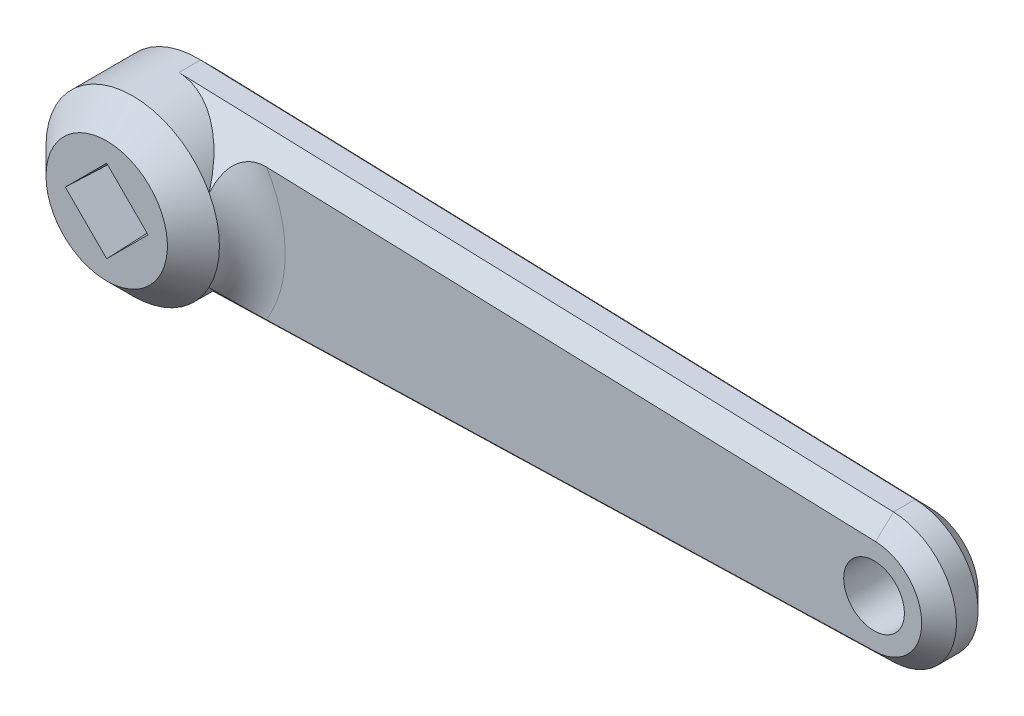
ISO-10303-21;
HEADER;
FILE_DESCRIPTION(('STEP AP214'),'2;1');
FILE_NAME('part.step','',(''),(''),'','','');
FILE_SCHEMA(('AUTOMOTIVE_DESIGN { 1 0 10303 214 1 1 1 1 }'));
ENDSEC;
DATA;
#1=APPLICATION_CONTEXT('core data for automotive mechanical design processes');
#2=APPLICATION_PROTOCOL_DEFINITION('international standard','automotive_design',2000,#1);
#3=PRODUCT_CONTEXT('',#1,'mechanical');
#4=PRODUCT('Part','Part','',(#3));
#5=PRODUCT_RELATED_PRODUCT_CATEGORY('part','',(#4));
#6=PRODUCT_DEFINITION_FORMATION('','',#4);
#7=PRODUCT_DEFINITION_CONTEXT('part definition',#1,'design');
#8=PRODUCT_DEFINITION('design','',#6,#7);
#9=PRODUCT_DEFINITION_SHAPE('','',#8);
#10=(LENGTH_UNIT() NAMED_UNIT(*) SI_UNIT(.MILLI.,.METRE.));
#11=(NAMED_UNIT(*) PLANE_ANGLE_UNIT() SI_UNIT($,.RADIAN.));
#12=(NAMED_UNIT(*) SI_UNIT($,.STERADIAN.) SOLID_ANGLE_UNIT());
#13=UNCERTAINTY_MEASURE_WITH_UNIT(LENGTH_MEASURE(1.E-05),#10,'distance_accuracy_value','');
#14=(GEOMETRIC_REPRESENTATION_CONTEXT(3) GLOBAL_UNCERTAINTY_ASSIGNED_CONTEXT((#13)) GLOBAL_UNIT_ASSIGNED_CONTEXT((#10,
#11,#12)) REPRESENTATION_CONTEXT('',''));
#15=CARTESIAN_POINT('',(0.,0.,0.));
#16=DIRECTION('',(0.,0.,1.));
#17=DIRECTION('',(1.,0.,0.));
#18=AXIS2_PLACEMENT_3D('',#15,#16,#17);
#19=CARTESIAN_POINT('',(-1.11022302462516E-12,9.54594154601793,24.999999999999));
#20=DIRECTION('',(-0.706676030840832,0.706676030840837,-0.0348994967024992));
#21=DIRECTION('',(-0.70710678118655,-0.707106781186545,0.));
#22=AXIS2_PLACEMENT_3D('',#19,#20,#21);
#23=PLANE('',#22);
#24=DIRECTION('',(0.0493253122023316,0.,-0.998782765958716));
#25=VECTOR('',#24,1.);
#26=CARTESIAN_POINT('',(-9.54594154601984,9.71445146547012E-13,24.9999999999989));
#27=LINE('',#26,#25);
#28=CARTESIAN_POINT('',(-9.54594154601942,5.42530033445851E-13,24.9999999999992));
#29=VERTEX_POINT('',#28);
#30=CARTESIAN_POINT('',(-8.75577473283918,2.00767137290004E-13,8.99999999999949));
#31=VERTEX_POINT('',#30);
#32=EDGE_CURVE('E116',#29,#31,#27,.T.);
#33=ORIENTED_EDGE('',*,*,#32,.T.);
#34=DIRECTION('',(0.707106781186624,0.707106781186471,0.));
#35=VECTOR('',#34,1.);
#36=CARTESIAN_POINT('',(-8.75577473283906,3.05311331771918E-13,8.99999999999901));
#37=LINE('',#36,#35);
#38=CARTESIAN_POINT('',(3.86821908839246E-13,8.75577473283835,8.99999999999955));
#39=VERTEX_POINT('',#38);
#40=EDGE_CURVE('E441',#31,#39,#37,.T.);
#41=ORIENTED_EDGE('',*,*,#40,.T.);
#42=DIRECTION('',(0.,0.0493253122023341,0.998782765958715));
#43=VECTOR('',#42,1.);
#44=CARTESIAN_POINT('',(1.57550838694731E-12,8.75577473283906,8.99999999999936));
#45=LINE('',#44,#43);
#46=CARTESIAN_POINT('',(-6.72071391349439E-13,9.54594154601836,24.999999999999));
#47=VERTEX_POINT('',#46);
#48=EDGE_CURVE('E106',#39,#47,#45,.T.);
#49=ORIENTED_EDGE('',*,*,#48,.T.);
#50=DIRECTION('',(0.707106781186613,0.707106781186482,0.));
#51=VECTOR('',#50,1.);
#52=CARTESIAN_POINT('',(-9.54594154601984,9.71445146547012E-13,24.9999999999992));
#53=LINE('',#52,#51);
#54=EDGE_CURVE('E442',#29,#47,#53,.T.);
#55=ORIENTED_EDGE('',*,*,#54,.F.);
#56=EDGE_LOOP('',(#33,#41,#49,#55));
#57=FACE_BOUND('',#56,.T.);
#58=ADVANCED_FACE('F16',(#57),#23,.F.);
#59=CARTESIAN_POINT('',(9.54594154601718,3.21964677141295E-12,24.9999999999994));
#60=DIRECTION('',(0.706676030840833,0.706676030840837,-0.0348994967024994));
#61=DIRECTION('',(-0.70710678118655,0.707106781186545,0.));
#62=AXIS2_PLACEMENT_3D('',#59,#60,#61);
#63=PLANE('',#62);
#64=ORIENTED_EDGE('',*,*,#48,.F.);
#65=DIRECTION('',(0.707106781186715,-0.707106781186381,0.));
#66=VECTOR('',#65,1.);
#67=CARTESIAN_POINT('',(-3.33066907387547E-13,8.75577473283715,8.99999999999901));
#68=LINE('',#67,#66);
#69=CARTESIAN_POINT('',(8.75577473283873,2.10169203004526E-12,8.99999999999976));
#70=VERTEX_POINT('',#69);
#71=EDGE_CURVE('E123',#39,#70,#68,.T.);
#72=ORIENTED_EDGE('',*,*,#71,.T.);
#73=DIRECTION('',(0.0493253122022692,0.,0.998782765958719));
#74=VECTOR('',#73,1.);
#75=CARTESIAN_POINT('',(8.75577473283896,1.98566206879858E-12,8.99999999999988));
#76=LINE('',#75,#74);
#77=CARTESIAN_POINT('',(9.54594154601751,2.88047219548951E-12,24.9999999999991));
#78=VERTEX_POINT('',#77);
#79=EDGE_CURVE('E112',#70,#78,#76,.T.);
#80=ORIENTED_EDGE('',*,*,#79,.T.);
#81=DIRECTION('',(0.70710678118668,-0.707106781186415,0.));
#82=VECTOR('',#81,1.);
#83=CARTESIAN_POINT('',(-1.11022302462516E-12,9.54594154601793,24.9999999999992));
#84=LINE('',#83,#82);
#85=EDGE_CURVE('E447',#47,#78,#84,.T.);
#86=ORIENTED_EDGE('',*,*,#85,.F.);
#87=EDGE_LOOP('',(#64,#72,#80,#86));
#88=FACE_BOUND('',#87,.T.);
#89=ADVANCED_FACE('F128',(#88),#63,.F.);
#90=CARTESIAN_POINT('',(-1.11022302462516E-13,-9.54594154601673,24.9999999999996));
#91=DIRECTION('',(0.706676030840832,-0.706676030840837,-0.0348994967024997));
#92=DIRECTION('',(0.70710678118655,0.707106781186545,0.));
#93=AXIS2_PLACEMENT_3D('',#90,#91,#92);
#94=PLANE('',#93);
#95=ORIENTED_EDGE('',*,*,#79,.F.);
#96=DIRECTION('',(-0.707106781186373,-0.707106781186722,0.));
#97=VECTOR('',#96,1.);
#98=CARTESIAN_POINT('',(8.75577473283873,2.22044604925031E-12,8.99999999999901));
#99=LINE('',#98,#97);
#100=CARTESIAN_POINT('',(-1.18421982289729E-12,-8.75577473284006,8.9999999999998));
#101=VERTEX_POINT('',#100);
#102=EDGE_CURVE('E115',#70,#101,#99,.T.);
#103=ORIENTED_EDGE('',*,*,#102,.T.);
#104=DIRECTION('',(-1.21280197952993E-13,-0.0493253122021546,0.998782765958725));
#105=VECTOR('',#104,1.);
#106=CARTESIAN_POINT('',(8.29197821516914E-13,-8.75577473284001,9.00000000000019));
#107=LINE('',#106,#105);
#108=CARTESIAN_POINT('',(-3.62139549743594E-13,-9.54594154601698,24.9999999999994));
#109=VERTEX_POINT('',#108);
#110=EDGE_CURVE('E129',#101,#109,#107,.T.);
#111=ORIENTED_EDGE('',*,*,#110,.T.);
#112=DIRECTION('',(-0.707106781186449,-0.707106781186646,0.));
#113=VECTOR('',#112,1.);
#114=CARTESIAN_POINT('',(9.54594154601718,3.21964677141295E-12,24.9999999999992));
#115=LINE('',#114,#113);
#116=EDGE_CURVE('E83',#78,#109,#115,.T.);
#117=ORIENTED_EDGE('',*,*,#116,.F.);
#118=EDGE_LOOP('',(#95,#103,#111,#117));
#119=FACE_BOUND('',#118,.T.);
#120=ADVANCED_FACE('F114',(#119),#94,.F.);
#121=CARTESIAN_POINT('',(-9.54594154601984,9.71445146547012E-13,24.9999999999989));
#122=DIRECTION('',(-0.706676030840833,-0.706676030840837,-0.0348994967024992));
#123=DIRECTION('',(0.70710678118655,-0.707106781186545,0.));
#124=AXIS2_PLACEMENT_3D('',#121,#122,#123);
#125=PLANE('',#124);
#126=ORIENTED_EDGE('',*,*,#110,.F.);
#127=DIRECTION('',(-0.707106781186419,0.707106781186676,0.));
#128=VECTOR('',#127,1.);
#129=CARTESIAN_POINT('',(-5.55111512312578E-13,-8.75577473284139,8.99999999999901));
#130=LINE('',#129,#128);
#131=EDGE_CURVE('E126',#101,#31,#130,.T.);
#132=ORIENTED_EDGE('',*,*,#131,.T.);
#133=ORIENTED_EDGE('',*,*,#32,.F.);
#134=DIRECTION('',(-0.707106781186623,0.707106781186472,0.));
#135=VECTOR('',#134,1.);
#136=CARTESIAN_POINT('',(-1.11022302462516E-13,-9.54594154601673,24.9999999999992));
#137=LINE('',#136,#135);
#138=EDGE_CURVE('E342',#109,#29,#137,.T.);
#139=ORIENTED_EDGE('',*,*,#138,.F.);
#140=EDGE_LOOP('',(#126,#132,#133,#139));
#141=FACE_BOUND('',#140,.T.);
#142=ADVANCED_FACE('F421',(#141),#125,.F.);
#143=CARTESIAN_POINT('',(7.7715611723761E-13,9.54594154601568,8.99999999999901));
#144=DIRECTION('',(0.,0.,-1.));
#145=DIRECTION('',(-1.,0.,0.));
#146=AXIS2_PLACEMENT_3D('',#143,#144,#145);
#147=PLANE('',#146);
#148=ORIENTED_EDGE('',*,*,#131,.F.);
#149=ORIENTED_EDGE('',*,*,#102,.F.);
#150=ORIENTED_EDGE('',*,*,#71,.F.);
#151=ORIENTED_EDGE('',*,*,#40,.F.);
#152=EDGE_LOOP('',(#148,#149,#150,#151));
#153=FACE_BOUND('',#152,.T.);
#154=CARTESIAN_POINT('',(-5.55111512312578E-13,-3.49720252756924E-12,8.99999999999987));
#155=DIRECTION('',(0.,0.,-1.));
#156=DIRECTION('',(-1.,0.,0.));
#157=AXIS2_PLACEMENT_3D('',#154,#155,#156);
#158=CIRCLE('',#157,6.00000000000007);
#159=CARTESIAN_POINT('',(-6.00000000000062,-3.49720252756924E-12,8.99999999999987));
#160=VERTEX_POINT('',#159);
#161=EDGE_CURVE('E340',#160,#160,#158,.T.);
#162=ORIENTED_EDGE('',*,*,#161,.T.);
#163=EDGE_LOOP('',(#162));
#164=FACE_BOUND('',#163,.T.);
#165=ADVANCED_FACE('F120',(#153,#164),#147,.F.);
#166=CARTESIAN_POINT('',(-5.55111512312578E-13,-3.49720252756924E-12,24.9999999999992));
#167=DIRECTION('',(0.,0.,1.));
#168=DIRECTION('',(1.,0.,0.));
#169=AXIS2_PLACEMENT_3D('',#166,#167,#168);
#170=PLANE('',#169);
#171=ORIENTED_EDGE('',*,*,#116,.T.);
#172=ORIENTED_EDGE('',*,*,#138,.T.);
#173=ORIENTED_EDGE('',*,*,#54,.T.);
#174=ORIENTED_EDGE('',*,*,#85,.T.);
#175=EDGE_LOOP('',(#171,#172,#173,#174));
#176=FACE_BOUND('',#175,.T.);
#177=CARTESIAN_POINT('',(-5.55111512312578E-13,-3.49720252756924E-12,24.9999999999993));
#178=DIRECTION('',(0.,0.,-1.));
#179=DIRECTION('',(-1.,0.,0.));
#180=AXIS2_PLACEMENT_3D('',#177,#178,#179);
#181=CIRCLE('',#180,14.0000000000001);
#182=CARTESIAN_POINT('',(-14.0000000000006,-3.49720252756924E-12,24.9999999999993));
#183=VERTEX_POINT('',#182);
#184=EDGE_CURVE('E337',#183,#183,#181,.T.);
#185=ORIENTED_EDGE('',*,*,#184,.F.);
#186=EDGE_LOOP('',(#185));
#187=FACE_BOUND('',#186,.T.);
#188=ADVANCED_FACE('F417',(#176,#187),#170,.T.);
#189=CARTESIAN_POINT('',(-5.55111512312578E-13,-3.49720252756924E-12,24.9999999999992));
#190=DIRECTION('',(0.,0.,-1.));
#191=DIRECTION('',(-1.,0.,0.));
#192=AXIS2_PLACEMENT_3D('',#189,#190,#191);
#193=CYLINDRICAL_SURFACE('',#192,6.00000000000007);
#194=CARTESIAN_POINT('',(-5.55111512312578E-13,-3.49720252756924E-12,7.00000000000006));
#195=DIRECTION('',(0.,0.,-1.));
#196=DIRECTION('',(-1.,0.,0.));
#197=AXIS2_PLACEMENT_3D('',#194,#195,#196);
#198=CIRCLE('',#197,6.00000000000007);
#199=CARTESIAN_POINT('',(-6.00000000000062,-3.49720252756924E-12,7.00000000000006));
#200=VERTEX_POINT('',#199);
#201=EDGE_CURVE('E162',#200,#200,#198,.F.);
#202=ORIENTED_EDGE('',*,*,#201,.F.);
#203=EDGE_LOOP('',(#202));
#204=FACE_BOUND('',#203,.T.);
#205=ORIENTED_EDGE('',*,*,#161,.F.);
#206=EDGE_LOOP('',(#205));
#207=FACE_BOUND('',#206,.T.);
#208=ADVANCED_FACE('F413',(#204,#207),#193,.F.);
#209=CARTESIAN_POINT('',(-5.55111512312578E-13,-3.49720252756924E-12,18.9999999999984));
#210=DIRECTION('',(0.,0.,-1.));
#211=DIRECTION('',(-1.,0.,0.));
#212=AXIS2_PLACEMENT_3D('',#209,#210,#211);
#213=CONICAL_SURFACE('',#212,20.0000000000009,0.785398163397447);
#214=CARTESIAN_POINT('',(-1.66533453693773E-12,-3.19189119579733E-12,18.9999999999992));
#215=DIRECTION('',(0.,0.,1.));
#216=DIRECTION('',(1.,0.,0.));
#217=AXIS2_PLACEMENT_3D('',#214,#215,#216);
#218=CIRCLE('',#217,20.0000000000001);
#219=CARTESIAN_POINT('',(17.5945735632283,-9.50952055196156,18.9999999999996));
#220=VERTEX_POINT('',#219);
#221=CARTESIAN_POINT('',(17.6365068293157,9.43152304028435,18.9999999999992));
#222=VERTEX_POINT('',#221);
#223=EDGE_CURVE('E74',#220,#222,#218,.T.);
#224=ORIENTED_EDGE('',*,*,#223,.T.);
#225=CARTESIAN_POINT('',(-5.55111512312578E-13,-3.52495810318487E-12,18.9999999999993));
#226=DIRECTION('',(0.,0.,-1.));
#227=DIRECTION('',(-1.,0.,0.));
#228=AXIS2_PLACEMENT_3D('',#225,#226,#227);
#229=CIRCLE('',#228,20.0000000000002);
#230=EDGE_CURVE('E71',#220,#222,#229,.T.);
#231=ORIENTED_EDGE('',*,*,#230,.F.);
#232=EDGE_LOOP('',(#224,#231));
#233=FACE_BOUND('',#232,.T.);
#234=ORIENTED_EDGE('',*,*,#184,.T.);
#235=EDGE_LOOP('',(#234));
#236=FACE_BOUND('',#235,.T.);
#237=ADVANCED_FACE('F416',(#233,#236),#213,.T.);
#238=CARTESIAN_POINT('',(0.520251892318857,15.9915395746817,12.9999999999998));
#239=DIRECTION('',(0.0229921025614232,0.706732879679291,0.707106781186563));
#240=DIRECTION('',(0.,-0.707293756647439,0.706919756271921));
#241=AXIS2_PLACEMENT_3D('',#238,#239,#240);
#242=PLANE('',#241);
#243=CARTESIAN_POINT('',(17.6365068293145,9.43152304028423,19.0000000000001));
#244=CARTESIAN_POINT('',(17.6324492783153,9.53117909508016,18.9005285752788));
#245=CARTESIAN_POINT('',(17.6299056692793,9.63084023198028,18.8010028441925));
#246=CARTESIAN_POINT('',(17.6281885334298,9.83014197728663,18.6018623189303));
#247=CARTESIAN_POINT('',(17.6290157066384,9.92978257713076,18.5022475105504));
#248=CARTESIAN_POINT('',(17.6370855623149,10.2291946594442,18.2027313529792));
#249=CARTESIAN_POINT('',(17.6499466304135,10.4288259824138,18.0027874031899));
#250=CARTESIAN_POINT('',(17.6943838686319,10.8306956315914,17.5996853434425));
#251=CARTESIAN_POINT('',(17.7263192638325,11.0329091198356,17.396540377844));
#252=CARTESIAN_POINT('',(17.8133847779586,11.4343072026391,16.992523545042));
#253=CARTESIAN_POINT('',(17.8684838220837,11.6334954860393,16.7916490013684));
#254=CARTESIAN_POINT('',(17.9811291504029,11.9544302251184,16.4672212184877));
#255=CARTESIAN_POINT('',(18.0303558416297,12.0777690070202,16.3423470127915));
#256=CARTESIAN_POINT('',(18.1410879119486,12.3215137805605,16.0951305902093));
#257=CARTESIAN_POINT('',(18.2025938506006,12.4419196382664,15.9727884889907));
#258=CARTESIAN_POINT('',(18.3384866330088,12.678101281287,15.7323130784671));
#259=CARTESIAN_POINT('',(18.4128001917013,12.7938990307777,15.6141601995187));
#260=CARTESIAN_POINT('',(18.5752154007747,13.0203990449581,15.3824989020004));
#261=CARTESIAN_POINT('',(18.663316415698,13.1311015441815,15.2689902696832));
#262=CARTESIAN_POINT('',(18.8547686121596,13.3475388437816,15.0464422065901));
#263=CARTESIAN_POINT('',(18.9582991199876,13.4531927834637,14.9374777628241));
#264=CARTESIAN_POINT('',(19.1794710297376,13.6567466416959,14.7268399700695));
#265=CARTESIAN_POINT('',(19.2971124766095,13.7546465355442,14.6251666443081));
#266=CARTESIAN_POINT('',(19.5456814416496,13.9416300786389,14.4301995690802));
#267=CARTESIAN_POINT('',(19.6766127970629,14.0307111668492,14.3369082545247));
#268=CARTESIAN_POINT('',(19.9504002536607,14.1992169701809,14.1595891504666));
#269=CARTESIAN_POINT('',(20.0932556714439,14.2786422380644,14.0755608307154));
#270=CARTESIAN_POINT('',(20.3702263616092,14.4178160614934,13.9274546912905));
#271=CARTESIAN_POINT('',(20.5031082611771,14.478781646804,13.8622005894223));
#272=CARTESIAN_POINT('',(20.7755826855021,14.5929503371223,13.7392325604049));
#273=CARTESIAN_POINT('',(20.9151775499641,14.6461507092257,13.6815212886378));
#274=CARTESIAN_POINT('',(21.2002809798759,14.7449481349988,13.5735057546975));
#275=CARTESIAN_POINT('',(21.3458045793323,14.7905241423418,13.5232220388803));
#276=CARTESIAN_POINT('',(21.6413578128167,14.8740829200713,13.4300973120132));
#277=CARTESIAN_POINT('',(21.7913885917128,14.9120637421236,13.387258211041));
#278=CARTESIAN_POINT('',(22.1802304176111,14.9999479921942,13.2867769511204));
#279=CARTESIAN_POINT('',(22.4215992289295,15.0445750188786,13.2343252358604));
#280=CARTESIAN_POINT('',(22.9099832529839,15.1171337909964,13.1459246615789));
#281=CARTESIAN_POINT('',(23.1570046162615,15.1450463557166,13.1099947731388));
#282=CARTESIAN_POINT('',(23.6515408939301,15.1851964379187,13.0537857067176));
#283=CARTESIAN_POINT('',(23.8990270913461,15.1975853325457,13.03335616539));
#284=CARTESIAN_POINT('',(24.3950950747173,15.208346169225,13.0064709995975));
#285=CARTESIAN_POINT('',(24.6436769115016,15.2067174539796,13.00001603043));
#286=CARTESIAN_POINT('',(24.8919033409767,15.1986579558828,12.9999999999994));
#287=B_SPLINE_CURVE_WITH_KNOTS('',3,(#243,#244,#245,#246,#247,#248,#249,#250,#251,#252,#253,
#254,#255,#256,#257,#258,#259,#260,#261,#262,#263,#264,#265,#266,#267,#268,#269,#270,#271,#272,
#273,#274,#275,#276,#277,#278,#279,#280,#281,#282,#283,#284,#285,#286),.UNSPECIFIED.,.F.,.F.,(4,
2,2,2,2,2,2,2,2,2,2,2,2,2,2,2,2,2,2,2,2,4),(0.,0.422572707385618,0.845233176390138,
1.69322462304153,2.55771330785163,3.42104593482224,3.96753104509211,4.51404106413532,
5.05752192134922,5.60097773714885,6.15132955288096,6.70168312178357,7.25219605081681,
7.80267745004968,8.28246890136818,8.76242880636775,9.24369248150447,9.72507945356262,
10.4767067010257,11.2291948350407,11.9742865782598,12.719413259662),.UNSPECIFIED.);
#288=CARTESIAN_POINT('',(24.8919033409765,15.198657955877,13.0000000000001));
#289=VERTEX_POINT('',#288);
#290=EDGE_CURVE('E176',#222,#289,#287,.T.);
#291=ORIENTED_EDGE('',*,*,#290,.T.);
#292=DIRECTION('',(-0.999471223417468,0.0325157432698232,0.));
#293=VECTOR('',#292,1.);
#294=CARTESIAN_POINT('',(165.35767317597,10.628892660848,12.9999999999995));
#295=LINE('',#294,#293);
#296=CARTESIAN_POINT('',(165.35767317597,10.6288926608479,12.9999999999998));
#297=VERTEX_POINT('',#296);
#298=EDGE_CURVE('E255',#297,#289,#295,.T.);
#299=ORIENTED_EDGE('',*,*,#298,.F.);
#300=DIRECTION('',(-0.0229921025612538,-0.706732879679311,0.707106781186549));
#301=VECTOR('',#300,1.);
#302=CARTESIAN_POINT('',(165.357673175969,10.6288926608476,13.0000000000001));
#303=LINE('',#302,#301);
#304=CARTESIAN_POINT('',(165.487736149049,14.626777554518,9.00000000000023));
#305=VERTEX_POINT('',#304);
#306=EDGE_CURVE('E165',#305,#297,#303,.T.);
#307=ORIENTED_EDGE('',*,*,#306,.F.);
#308=DIRECTION('',(0.999471223417468,-0.0325157432698273,0.));
#309=VECTOR('',#308,1.);
#310=CARTESIAN_POINT('',(0.650314865397128,19.9894244683475,8.99999999999973));
#311=LINE('',#310,#309);
#312=CARTESIAN_POINT('',(0.650314865396452,19.9894244683468,9.0000000000026));
#313=VERTEX_POINT('',#312);
#314=EDGE_CURVE('E273',#305,#313,#311,.F.);
#315=ORIENTED_EDGE('',*,*,#314,.T.);
#316=CARTESIAN_POINT('',(-5.55111512312578E-13,-3.52495810318487E-12,29.0000000000048));
#317=DIRECTION('',(0.0229921025614232,0.706732879679291,0.707106781186563));
#318=DIRECTION('',(0.0229921025614242,0.706732879679322,-0.707106781186532));
#319=AXIS2_PLACEMENT_3D('',#316,#317,#318);
#320=ELLIPSE('',#319,28.2842712474616,20.0000000000002);
#321=EDGE_CURVE('E156',#222,#313,#320,.T.);
#322=ORIENTED_EDGE('',*,*,#321,.F.);
#323=EDGE_LOOP('',(#291,#299,#307,#315,#322));
#324=FACE_BOUND('',#323,.T.);
#325=ADVANCED_FACE('F329',(#324),#242,.T.);
#326=CARTESIAN_POINT('',(-1.66533453693773E-12,-3.19189119579733E-12,22.9999999999994));
#327=DIRECTION('',(0.,0.,1.));
#328=DIRECTION('',(1.,0.,0.));
#329=AXIS2_PLACEMENT_3D('',#326,#327,#328);
#330=TOROIDAL_SURFACE('',#329,29.1651513899117,10.);
#331=ORIENTED_EDGE('',*,*,#223,.F.);
#332=CARTESIAN_POINT('',(24.8243635479129,-15.3087239846264,12.9999999999994));
#333=CARTESIAN_POINT('',(24.61940779402,-15.3144751289374,13.0000083363896));
#334=CARTESIAN_POINT('',(24.4142661577957,-15.3158368348773,13.0044096005062));
#335=CARTESIAN_POINT('',(24.0043553764543,-15.3091428880275,13.0226153080731));
#336=CARTESIAN_POINT('',(23.7995868223742,-15.301077655926,13.036429310453));
#337=CARTESIAN_POINT('',(23.3888426034192,-15.2747008043941,13.0743335670586));
#338=CARTESIAN_POINT('',(23.1828877637396,-15.2562527888287,13.0985595786169));
#339=CARTESIAN_POINT('',(22.7738911537192,-15.2083045637055,13.1579776063259));
#340=CARTESIAN_POINT('',(22.5708486653336,-15.1788071287797,13.1931668691094));
#341=CARTESIAN_POINT('',(22.1678293661658,-15.1078069693373,13.2754598320042));
#342=CARTESIAN_POINT('',(21.9678821519048,-15.066225250129,13.3226416642687));
#343=CARTESIAN_POINT('',(21.5744268339442,-14.9704757266588,13.4294055726048));
#344=CARTESIAN_POINT('',(21.380917031594,-14.9163112732268,13.4889843468837));
#345=CARTESIAN_POINT('',(21.0035028690187,-14.7951942623352,13.6206551361877));
#346=CARTESIAN_POINT('',(20.8195544888532,-14.7283084473324,13.6926816716136));
#347=CARTESIAN_POINT('',(20.4627174378181,-14.5813754720743,13.8495802267598));
#348=CARTESIAN_POINT('',(20.2898261971301,-14.5013313855208,13.9344492461775));
#349=CARTESIAN_POINT('',(19.9764553729948,-14.3381336959012,14.1063851303931));
#350=CARTESIAN_POINT('',(19.8345225968731,-14.2563588563141,14.1921145959873));
#351=CARTESIAN_POINT('',(19.5629674553834,-14.0831852585852,14.3728478484202));
#352=CARTESIAN_POINT('',(19.4333439699496,-13.9917873776769,14.4678507898343));
#353=CARTESIAN_POINT('',(19.18773600952,-13.800260999647,14.6662007236733));
#354=CARTESIAN_POINT('',(19.0717477165675,-13.7001349602166,14.7695453666232));
#355=CARTESIAN_POINT('',(18.8541591062038,-13.4922698993593,14.9834404718929));
#356=CARTESIAN_POINT('',(18.752558349999,-13.3845311102578,15.0939907143049));
#357=CARTESIAN_POINT('',(18.5766660704664,-13.1776979068519,15.3056831185177));
#358=CARTESIAN_POINT('',(18.5005394503817,-13.0793950190525,15.406085614057));
#359=CARTESIAN_POINT('',(18.3589837597616,-12.878893851687,15.6104839653872));
#360=CARTESIAN_POINT('',(18.2935559182694,-12.7766951262395,15.7144802323597));
#361=CARTESIAN_POINT('',(18.1727128657357,-12.5687963934379,15.9256914116044));
#362=CARTESIAN_POINT('',(18.1173386942892,-12.4630840308547,16.032917521427));
#363=CARTESIAN_POINT('',(18.0162800958074,-12.2492735336539,16.2494823865582));
#364=CARTESIAN_POINT('',(17.970595297335,-12.1411754906655,16.3588210607073));
#365=CARTESIAN_POINT('',(17.8515850794543,-11.826498614027,16.6767167645063));
#366=CARTESIAN_POINT('',(17.7896733413454,-11.6175937255133,16.8872783206135));
#367=CARTESIAN_POINT('',(17.6921854967082,-11.196150373866,17.3112938052049));
#368=CARTESIAN_POINT('',(17.6566566977946,-10.9836060794131,17.5247522338355));
#369=CARTESIAN_POINT('',(17.6196870969647,-10.6654521581069,17.8438190876542));
#370=CARTESIAN_POINT('',(17.610098541733,-10.5603830283474,17.9491160995859));
#371=CARTESIAN_POINT('',(17.5956068587696,-10.3500071665313,18.1598160182347));
#372=CARTESIAN_POINT('',(17.5907040504062,-10.2447004187694,18.2652189316796));
#373=CARTESIAN_POINT('',(17.5851173243202,-10.0344141536309,18.4755791485865));
#374=CARTESIAN_POINT('',(17.5844160099373,-9.92943508832557,18.580536488828));
#375=CARTESIAN_POINT('',(17.5867762424695,-9.71947043005509,18.7903519955448));
#376=CARTESIAN_POINT('',(17.5898368442173,-9.61448484535368,18.8952101803094));
#377=CARTESIAN_POINT('',(17.5945735632279,-9.50952055196194,18.999999999998));
#378=B_SPLINE_CURVE_WITH_KNOTS('',3,(#332,#333,#334,#335,#336,#337,#338,#339,#340,#341,#342,
#343,#344,#345,#346,#347,#348,#349,#350,#351,#352,#353,#354,#355,#356,#357,#358,#359,#360,#361,
#362,#363,#364,#365,#366,#367,#368,#369,#370,#371,#372,#373,#374,#375,#376,#377),.UNSPECIFIED.,
.F.,.F.,(4,2,2,2,2,2,2,2,2,2,2,2,2,2,2,2,2,2,2,2,2,2,4),(0.,0.615108484603668,1.23084256388225,
1.85486079873995,2.47872244062249,3.10675768972841,3.73462588199718,4.35928656677739,
4.98380154097317,5.53759018554724,6.09132839055271,6.64491117349228,7.19847706953357,
7.67744772929931,8.15647337316508,8.63741249287798,9.11833317270174,10.0257181667913,
10.9347263024822,11.3818476145662,11.8289993991119,12.2742984250805,12.7194855941989),.UNSPECIFIED.);
#379=CARTESIAN_POINT('',(24.824363547913,-15.3087239846309,12.9999999999989));
#380=VERTEX_POINT('',#379);
#381=EDGE_CURVE('E166',#380,#220,#378,.T.);
#382=ORIENTED_EDGE('',*,*,#381,.F.);
#383=CARTESIAN_POINT('',(-1.66533453693773E-12,-3.19189119579733E-12,12.9999999999994));
#384=DIRECTION('',(0.,0.,1.));
#385=DIRECTION('',(0.851165255960237,-0.524897806288181,0.));
#386=AXIS2_PLACEMENT_3D('',#383,#384,#385);
#387=CIRCLE('',#386,29.1651513899121);
#388=CARTESIAN_POINT('',(29.1651513899104,-3.06480039213252E-12,12.9999999999994));
#389=VERTEX_POINT('',#388);
#390=EDGE_CURVE('E238',#389,#380,#387,.F.);
#391=ORIENTED_EDGE('',*,*,#390,.F.);
#392=CARTESIAN_POINT('',(-1.66533453693773E-12,-3.19189119579733E-12,12.9999999999994));
#393=DIRECTION('',(0.,0.,1.));
#394=DIRECTION('',(1.,0.,0.));
#395=AXIS2_PLACEMENT_3D('',#392,#393,#394);
#396=CIRCLE('',#395,29.1651513899109);
#397=EDGE_CURVE('E245',#289,#389,#396,.F.);
#398=ORIENTED_EDGE('',*,*,#397,.F.);
#399=ORIENTED_EDGE('',*,*,#290,.F.);
#400=EDGE_LOOP('',(#331,#382,#391,#398,#399));
#401=FACE_BOUND('',#400,.T.);
#402=ADVANCED_FACE('F178',(#401),#330,.F.);
#403=CARTESIAN_POINT('',(0.449440324645889,-15.9936863603931,12.9999999999995));
#404=DIRECTION('',(0.0198626438309867,-0.706827755100228,0.707106781186559));
#405=DIRECTION('',(0.,-0.707246307990044,-0.706967226846091));
#406=AXIS2_PLACEMENT_3D('',#403,#404,#405);
#407=PLANE('',#406);
#408=DIRECTION('',(0.999605397524484,0.0280900202904469,0.));
#409=VECTOR('',#408,1.);
#410=CARTESIAN_POINT('',(24.8243635479133,-15.3087239846316,12.9999999999995));
#411=LINE('',#410,#409);
#412=CARTESIAN_POINT('',(165.308990223198,-11.3609501695106,12.9999999999998));
#413=VERTEX_POINT('',#412);
#414=EDGE_CURVE('E155',#380,#413,#411,.T.);
#415=ORIENTED_EDGE('',*,*,#414,.F.);
#416=ORIENTED_EDGE('',*,*,#381,.T.);
#417=CARTESIAN_POINT('',(-5.55111512312578E-13,-3.52495810318487E-12,28.9999999999968));
#418=DIRECTION('',(0.0198626438309867,-0.706827755100228,0.707106781186559));
#419=DIRECTION('',(0.0198626438309873,-0.70682775510025,-0.707106781186536));
#420=AXIS2_PLACEMENT_3D('',#417,#418,#419);
#421=ELLIPSE('',#420,28.2842712474618,20.0000000000002);
#422=CARTESIAN_POINT('',(0.561800405806601,-19.9921079504924,8.9999999999986));
#423=VERTEX_POINT('',#422);
#424=EDGE_CURVE('E159',#423,#220,#421,.T.);
#425=ORIENTED_EDGE('',*,*,#424,.F.);
#426=DIRECTION('',(-0.999605397524486,-0.0280900202903762,0.));
#427=VECTOR('',#426,1.);
#428=CARTESIAN_POINT('',(165.421350304357,-15.3593717596093,9.00000000000001));
#429=LINE('',#428,#427);
#430=CARTESIAN_POINT('',(165.421350304358,-15.3593717596111,9.0000000000003));
#431=VERTEX_POINT('',#430);
#432=EDGE_CURVE('E300',#423,#431,#429,.F.);
#433=ORIENTED_EDGE('',*,*,#432,.T.);
#434=DIRECTION('',(-0.0198626438309455,0.706827755100239,0.707106781186549));
#435=VECTOR('',#434,1.);
#436=CARTESIAN_POINT('',(165.308990223197,-11.3609501695142,13.0000000000001));
#437=LINE('',#436,#435);
#438=EDGE_CURVE('E169',#413,#431,#437,.F.);
#439=ORIENTED_EDGE('',*,*,#438,.F.);
#440=EDGE_LOOP('',(#415,#416,#425,#433,#439));
#441=FACE_BOUND('',#440,.T.);
#442=ADVANCED_FACE('F182',(#441),#407,.T.);
#443=CARTESIAN_POINT('',(165.000000000003,-0.365290796744772,9.00000000000174));
#444=DIRECTION('',(0.,0.,-1.));
#445=DIRECTION('',(-1.,0.,0.));
#446=AXIS2_PLACEMENT_3D('',#443,#444,#445);
#447=CONICAL_SURFACE('',#446,14.9999999999985,0.785398163397446);
#448=ORIENTED_EDGE('',*,*,#306,.T.);
#449=CARTESIAN_POINT('',(165.000000000003,-0.365290796744772,12.9999999999998));
#450=DIRECTION('',(0.,0.,-1.));
#451=DIRECTION('',(-1.,0.,0.));
#452=AXIS2_PLACEMENT_3D('',#449,#450,#451);
#453=CIRCLE('',#452,11.0000000000004);
#454=EDGE_CURVE('E152',#413,#297,#453,.F.);
#455=ORIENTED_EDGE('',*,*,#454,.F.);
#456=ORIENTED_EDGE('',*,*,#438,.T.);
#457=CARTESIAN_POINT('',(165.000000000003,-0.365290796744772,8.99999999999973));
#458=DIRECTION('',(0.,0.,-1.));
#459=DIRECTION('',(-1.,0.,0.));
#460=AXIS2_PLACEMENT_3D('',#457,#458,#459);
#461=CIRCLE('',#460,15.0000000000002);
#462=EDGE_CURVE('E295',#305,#431,#461,.T.);
#463=ORIENTED_EDGE('',*,*,#462,.F.);
#464=EDGE_LOOP('',(#448,#455,#456,#463));
#465=FACE_BOUND('',#464,.T.);
#466=ADVANCED_FACE('F186',(#465),#447,.T.);
#467=CARTESIAN_POINT('',(-7.7715611723761E-13,-3.60822483003176E-12,7.00000000000006));
#468=DIRECTION('',(0.,0.,-1.));
#469=DIRECTION('',(-1.,0.,0.));
#470=AXIS2_PLACEMENT_3D('',#467,#468,#469);
#471=PLANE('',#470);
#472=CARTESIAN_POINT('',(-7.7715611723761E-13,-3.60822483003176E-12,7.00000000000006));
#473=DIRECTION('',(0.,0.,-1.));
#474=DIRECTION('',(-1.,0.,0.));
#475=AXIS2_PLACEMENT_3D('',#472,#473,#474);
#476=CIRCLE('',#475,12.5000000000001);
#477=CARTESIAN_POINT('',(-12.5000000000009,-3.60822483003176E-12,7.00000000000006));
#478=VERTEX_POINT('',#477);
#479=EDGE_CURVE('E148',#478,#478,#476,.T.);
#480=ORIENTED_EDGE('',*,*,#479,.T.);
#481=EDGE_LOOP('',(#480));
#482=FACE_BOUND('',#481,.T.);
#483=ORIENTED_EDGE('',*,*,#201,.T.);
#484=EDGE_LOOP('',(#483));
#485=FACE_BOUND('',#484,.T.);
#486=ADVANCED_FACE('F190',(#482,#485),#471,.T.);
#487=CARTESIAN_POINT('',(-5.55111512312578E-13,-3.52495810318487E-12,12.9999999999995));
#488=DIRECTION('',(0.,0.,-1.));
#489=DIRECTION('',(-1.,0.,0.));
#490=AXIS2_PLACEMENT_3D('',#487,#488,#489);
#491=CYLINDRICAL_SURFACE('',#490,20.0000000000002);
#492=DIRECTION('',(0.,0.,1.));
#493=VECTOR('',#492,1.);
#494=CARTESIAN_POINT('',(0.650314865396792,19.9894244683475,12.9999999999997));
#495=LINE('',#494,#493);
#496=CARTESIAN_POINT('',(0.650314865396569,19.9894244683464,3.99999999999992));
#497=VERTEX_POINT('',#496);
#498=EDGE_CURVE('E257',#313,#497,#495,.F.);
#499=ORIENTED_EDGE('',*,*,#498,.T.);
#500=CARTESIAN_POINT('',(0.,-1.52655665885959E-12,3.99999999999992));
#501=DIRECTION('',(0.,0.,1.));
#502=DIRECTION('',(1.,0.,0.));
#503=AXIS2_PLACEMENT_3D('',#500,#501,#502);
#504=CIRCLE('',#503,20.0000000000001);
#505=CARTESIAN_POINT('',(0.561800405806372,-19.9921079504921,4.00000000000202));
#506=VERTEX_POINT('',#505);
#507=EDGE_CURVE('E151',#506,#497,#504,.F.);
#508=ORIENTED_EDGE('',*,*,#507,.F.);
#509=DIRECTION('',(0.,0.,1.));
#510=VECTOR('',#509,1.);
#511=CARTESIAN_POINT('',(0.561800405806279,-19.9921079504912,13.0000000000001));
#512=LINE('',#511,#510);
#513=EDGE_CURVE('E158',#506,#423,#512,.T.);
#514=ORIENTED_EDGE('',*,*,#513,.T.);
#515=ORIENTED_EDGE('',*,*,#424,.T.);
#516=ORIENTED_EDGE('',*,*,#230,.T.);
#517=ORIENTED_EDGE('',*,*,#321,.T.);
#518=EDGE_LOOP('',(#499,#508,#514,#515,#516,#517));
#519=FACE_BOUND('',#518,.T.);
#520=ADVANCED_FACE('F194',(#519),#491,.T.);
#521=CARTESIAN_POINT('',(165.421350304357,-15.3593717596093,13.0000000000001));
#522=DIRECTION('',(-0.0280900202903762,0.999605397524486,0.));
#523=DIRECTION('',(-0.999605397524486,-0.0280900202903762,0.));
#524=AXIS2_PLACEMENT_3D('',#521,#522,#523);
#525=PLANE('',#524);
#526=ORIENTED_EDGE('',*,*,#432,.F.);
#527=ORIENTED_EDGE('',*,*,#513,.F.);
#528=DIRECTION('',(0.999605397524486,0.0280900202903914,0.));
#529=VECTOR('',#528,1.);
#530=CARTESIAN_POINT('',(0.56180040580639,-19.9921079504919,4.00000000000335));
#531=LINE('',#530,#529);
#532=CARTESIAN_POINT('',(165.421350304359,-15.3593717596091,3.99999999999978));
#533=VERTEX_POINT('',#532);
#534=EDGE_CURVE('E262',#506,#533,#531,.T.);
#535=ORIENTED_EDGE('',*,*,#534,.T.);
#536=DIRECTION('',(0.,0.,-1.));
#537=VECTOR('',#536,1.);
#538=CARTESIAN_POINT('',(165.421350304358,-15.3593717596123,13.0000000000001));
#539=LINE('',#538,#537);
#540=EDGE_CURVE('E279',#431,#533,#539,.T.);
#541=ORIENTED_EDGE('',*,*,#540,.F.);
#542=EDGE_LOOP('',(#526,#527,#535,#541));
#543=FACE_BOUND('',#542,.T.);
#544=ADVANCED_FACE('F198',(#543),#525,.F.);
#545=CARTESIAN_POINT('',(165.000000000003,-0.365290796744772,13.0000000000001));
#546=DIRECTION('',(0.,0.,-1.));
#547=DIRECTION('',(-1.,0.,0.));
#548=AXIS2_PLACEMENT_3D('',#545,#546,#547);
#549=CYLINDRICAL_SURFACE('',#548,15.0000000000002);
#550=ORIENTED_EDGE('',*,*,#540,.T.);
#551=CARTESIAN_POINT('',(165.000000000004,-0.365290796740858,4.00000000000065));
#552=DIRECTION('',(0.,0.,1.));
#553=DIRECTION('',(1.,0.,0.));
#554=AXIS2_PLACEMENT_3D('',#551,#552,#553);
#555=CIRCLE('',#554,15.0000000000008);
#556=CARTESIAN_POINT('',(165.48773614905,14.6267775545199,4.00000000000288));
#557=VERTEX_POINT('',#556);
#558=EDGE_CURVE('E282',#557,#533,#555,.F.);
#559=ORIENTED_EDGE('',*,*,#558,.F.);
#560=DIRECTION('',(0.,0.,1.));
#561=VECTOR('',#560,1.);
#562=CARTESIAN_POINT('',(165.48773614905,14.6267775545194,12.9999999999997));
#563=LINE('',#562,#561);
#564=EDGE_CURVE('E276',#557,#305,#563,.T.);
#565=ORIENTED_EDGE('',*,*,#564,.T.);
#566=ORIENTED_EDGE('',*,*,#462,.T.);
#567=EDGE_LOOP('',(#550,#559,#565,#566));
#568=FACE_BOUND('',#567,.T.);
#569=ADVANCED_FACE('F202',(#568),#549,.T.);
#570=CARTESIAN_POINT('',(0.650314865397128,19.9894244683475,12.9999999999997));
#571=DIRECTION('',(-0.0325157432698273,-0.999471223417468,0.));
#572=DIRECTION('',(0.999471223417468,-0.0325157432698273,0.));
#573=AXIS2_PLACEMENT_3D('',#570,#571,#572);
#574=PLANE('',#573);
#575=ORIENTED_EDGE('',*,*,#314,.F.);
#576=ORIENTED_EDGE('',*,*,#564,.F.);
#577=DIRECTION('',(-0.999471223417469,0.0325157432698147,0.));
#578=VECTOR('',#577,1.);
#579=CARTESIAN_POINT('',(165.48773614905,14.626777554519,4.00000000000363));
#580=LINE('',#579,#578);
#581=EDGE_CURVE('E265',#557,#497,#580,.T.);
#582=ORIENTED_EDGE('',*,*,#581,.T.);
#583=ORIENTED_EDGE('',*,*,#498,.F.);
#584=EDGE_LOOP('',(#575,#576,#582,#583));
#585=FACE_BOUND('',#584,.T.);
#586=ADVANCED_FACE('F206',(#585),#574,.F.);
#587=CARTESIAN_POINT('',(-5.55111512312578E-13,-3.52495810318487E-12,12.9999999999995));
#588=DIRECTION('',(0.,0.,1.));
#589=DIRECTION('',(1.,0.,0.));
#590=AXIS2_PLACEMENT_3D('',#587,#588,#589);
#591=PLANE('',#590);
#592=CARTESIAN_POINT('',(165.000000000003,-0.365290796744772,13.0000000000001));
#593=DIRECTION('',(0.,0.,-1.));
#594=DIRECTION('',(-1.,0.,0.));
#595=AXIS2_PLACEMENT_3D('',#592,#593,#594);
#596=CIRCLE('',#595,7.00000000000009);
#597=CARTESIAN_POINT('',(158.000000000003,-0.365290796744772,13.0000000000001));
#598=VERTEX_POINT('',#597);
#599=EDGE_CURVE('E144',#598,#598,#596,.T.);
#600=ORIENTED_EDGE('',*,*,#599,.T.);
#601=EDGE_LOOP('',(#600));
#602=FACE_BOUND('',#601,.T.);
#603=ORIENTED_EDGE('',*,*,#414,.T.);
#604=ORIENTED_EDGE('',*,*,#454,.T.);
#605=ORIENTED_EDGE('',*,*,#298,.T.);
#606=ORIENTED_EDGE('',*,*,#397,.T.);
#607=ORIENTED_EDGE('',*,*,#390,.T.);
#608=EDGE_LOOP('',(#603,#604,#605,#606,#607));
#609=FACE_BOUND('',#608,.T.);
#610=ADVANCED_FACE('F210',(#602,#609),#591,.T.);
#611=CARTESIAN_POINT('',(-7.7715611723761E-13,-3.60822483003176E-12,7.00000000000006));
#612=DIRECTION('',(0.,0.,-1.));
#613=DIRECTION('',(-1.,0.,0.));
#614=AXIS2_PLACEMENT_3D('',#611,#612,#613);
#615=CYLINDRICAL_SURFACE('',#614,12.5000000000001);
#616=ORIENTED_EDGE('',*,*,#479,.F.);
#617=EDGE_LOOP('',(#616));
#618=FACE_BOUND('',#617,.T.);
#619=CARTESIAN_POINT('',(-7.7715611723761E-13,-3.60822483003176E-12,0.));
#620=DIRECTION('',(0.,0.,-1.));
#621=DIRECTION('',(-1.,0.,0.));
#622=AXIS2_PLACEMENT_3D('',#619,#620,#621);
#623=CIRCLE('',#622,12.5000000000001);
#624=CARTESIAN_POINT('',(-12.5000000000009,-3.60822483003176E-12,0.));
#625=VERTEX_POINT('',#624);
#626=EDGE_CURVE('E141',#625,#625,#623,.T.);
#627=ORIENTED_EDGE('',*,*,#626,.T.);
#628=EDGE_LOOP('',(#627));
#629=FACE_BOUND('',#628,.T.);
#630=ADVANCED_FACE('F215',(#618,#629),#615,.F.);
#631=CARTESIAN_POINT('',(0.,-1.52655665885959E-12,4.00000000000187));
#632=DIRECTION('',(0.,0.,1.));
#633=DIRECTION('',(0.,-1.,0.));
#634=AXIS2_PLACEMENT_3D('',#631,#632,#633);
#635=CONICAL_SURFACE('',#634,20.0000000000021,0.78539816339745);
#636=DIRECTION('',(0.0198626438308881,-0.706827755100258,0.707106781186532));
#637=VECTOR('',#636,1.);
#638=CARTESIAN_POINT('',(0.449440324645417,-15.9936863603917,1.31058358610048E-12));
#639=LINE('',#638,#637);
#640=CARTESIAN_POINT('',(0.449440324645897,-15.9936863603918,3.77649163814915E-13));
#641=VERTEX_POINT('',#640);
#642=EDGE_CURVE('E290',#641,#506,#639,.T.);
#643=ORIENTED_EDGE('',*,*,#642,.T.);
#644=ORIENTED_EDGE('',*,*,#507,.T.);
#645=DIRECTION('',(-0.0229921025612749,-0.706732879679324,-0.707106781186535));
#646=VECTOR('',#645,1.);
#647=CARTESIAN_POINT('',(0.650314865396462,19.989424468345,3.99999999999992));
#648=LINE('',#647,#646);
#649=CARTESIAN_POINT('',(0.520251892317547,15.9915395746772,3.77128975405473E-13));
#650=VERTEX_POINT('',#649);
#651=EDGE_CURVE('E147',#497,#650,#648,.T.);
#652=ORIENTED_EDGE('',*,*,#651,.T.);
#653=CARTESIAN_POINT('',(0.,-1.52664339503339E-12,3.77302356024956E-13));
#654=DIRECTION('',(0.,0.,1.));
#655=DIRECTION('',(0.,-1.,0.));
#656=AXIS2_PLACEMENT_3D('',#653,#654,#655);
#657=CIRCLE('',#656,16.0000000000006);
#658=EDGE_CURVE('E138',#650,#641,#657,.T.);
#659=ORIENTED_EDGE('',*,*,#658,.T.);
#660=EDGE_LOOP('',(#643,#644,#652,#659));
#661=FACE_BOUND('',#660,.T.);
#662=ADVANCED_FACE('F360',(#661),#635,.T.);
#663=CARTESIAN_POINT('',(165.421350304359,-15.3593717596074,3.9999999999995));
#664=DIRECTION('',(-0.0198626438309865,0.706827755100223,0.707106781186563));
#665=DIRECTION('',(0.,-0.707246307990049,0.706967226846086));
#666=AXIS2_PLACEMENT_3D('',#663,#664,#665);
#667=PLANE('',#666);
#668=DIRECTION('',(0.999605397524486,0.028090020290401,0.));
#669=VECTOR('',#668,1.);
#670=CARTESIAN_POINT('',(0.449440324645445,-15.9936863603929,0.));
#671=LINE('',#670,#669);
#672=CARTESIAN_POINT('',(165.308990223198,-11.3609501695077,-1.79890824458795E-12));
#673=VERTEX_POINT('',#672);
#674=EDGE_CURVE('E137',#641,#673,#671,.T.);
#675=ORIENTED_EDGE('',*,*,#674,.T.);
#676=DIRECTION('',(-0.0198626438309566,0.706827755100241,-0.707106781186546));
#677=VECTOR('',#676,1.);
#678=CARTESIAN_POINT('',(165.421350304359,-15.3593717596084,4.00000000000006));
#679=LINE('',#678,#677);
#680=EDGE_CURVE('E285',#533,#673,#679,.T.);
#681=ORIENTED_EDGE('',*,*,#680,.F.);
#682=ORIENTED_EDGE('',*,*,#534,.F.);
#683=ORIENTED_EDGE('',*,*,#642,.F.);
#684=EDGE_LOOP('',(#675,#681,#682,#683));
#685=FACE_BOUND('',#684,.T.);
#686=ADVANCED_FACE('F392',(#685),#667,.F.);
#687=CARTESIAN_POINT('',(165.000000000004,-0.365290796740858,4.00000000000065));
#688=DIRECTION('',(0.,0.,1.));
#689=DIRECTION('',(1.,0.,0.));
#690=AXIS2_PLACEMENT_3D('',#687,#688,#689);
#691=CONICAL_SURFACE('',#690,15.0000000000008,0.78539816339745);
#692=DIRECTION('',(0.0229921025614768,0.706732879679317,0.707106781186535));
#693=VECTOR('',#692,1.);
#694=CARTESIAN_POINT('',(165.35767317597,10.6288926608489,3.56962723269127E-12));
#695=LINE('',#694,#693);
#696=CARTESIAN_POINT('',(165.357673175971,10.6288926608486,-6.23633089613662E-13));
#697=VERTEX_POINT('',#696);
#698=EDGE_CURVE('E268',#697,#557,#695,.T.);
#699=ORIENTED_EDGE('',*,*,#698,.T.);
#700=ORIENTED_EDGE('',*,*,#558,.T.);
#701=ORIENTED_EDGE('',*,*,#680,.T.);
#702=CARTESIAN_POINT('',(165.000000000004,-0.365290796740858,-1.79890824458795E-12));
#703=DIRECTION('',(0.,0.,1.));
#704=DIRECTION('',(1.,0.,0.));
#705=AXIS2_PLACEMENT_3D('',#702,#703,#704);
#706=CIRCLE('',#705,10.9999999999983);
#707=EDGE_CURVE('E36',#673,#697,#706,.T.);
#708=ORIENTED_EDGE('',*,*,#707,.T.);
#709=EDGE_LOOP('',(#699,#700,#701,#708));
#710=FACE_BOUND('',#709,.T.);
#711=ADVANCED_FACE('F375',(#710),#691,.T.);
#712=CARTESIAN_POINT('',(0.650314865396462,19.989424468345,3.99999999999992));
#713=DIRECTION('',(-0.0229921025614223,-0.706732879679294,0.70710678118656));
#714=DIRECTION('',(0.,-0.707293756647436,-0.706919756271925));
#715=AXIS2_PLACEMENT_3D('',#712,#713,#714);
#716=PLANE('',#715);
#717=ORIENTED_EDGE('',*,*,#581,.F.);
#718=ORIENTED_EDGE('',*,*,#698,.F.);
#719=DIRECTION('',(-0.999471223417469,0.0325157432698185,0.));
#720=VECTOR('',#719,1.);
#721=CARTESIAN_POINT('',(165.35767317597,10.6288926608525,0.));
#722=LINE('',#721,#720);
#723=EDGE_CURVE('E27',#697,#650,#722,.T.);
#724=ORIENTED_EDGE('',*,*,#723,.T.);
#725=ORIENTED_EDGE('',*,*,#651,.F.);
#726=EDGE_LOOP('',(#717,#718,#724,#725));
#727=FACE_BOUND('',#726,.T.);
#728=ADVANCED_FACE('F369',(#727),#716,.F.);
#729=CARTESIAN_POINT('',(165.000000000003,-0.365290796744772,13.0000000000001));
#730=DIRECTION('',(0.,0.,-1.));
#731=DIRECTION('',(-1.,0.,0.));
#732=AXIS2_PLACEMENT_3D('',#729,#730,#731);
#733=CYLINDRICAL_SURFACE('',#732,7.00000000000009);
#734=CARTESIAN_POINT('',(165.000000000003,-0.365290796744772,3.33066907387547E-13));
#735=DIRECTION('',(0.,0.,-1.));
#736=DIRECTION('',(-1.,0.,0.));
#737=AXIS2_PLACEMENT_3D('',#734,#735,#736);
#738=CIRCLE('',#737,7.00000000000009);
#739=CARTESIAN_POINT('',(158.000000000003,-0.365290796744772,3.33066907387547E-13));
#740=VERTEX_POINT('',#739);
#741=EDGE_CURVE('E11',#740,#740,#738,.T.);
#742=ORIENTED_EDGE('',*,*,#741,.T.);
#743=EDGE_LOOP('',(#742));
#744=FACE_BOUND('',#743,.T.);
#745=ORIENTED_EDGE('',*,*,#599,.F.);
#746=EDGE_LOOP('',(#745));
#747=FACE_BOUND('',#746,.T.);
#748=ADVANCED_FACE('F398',(#744,#747),#733,.F.);
#749=CARTESIAN_POINT('',(-3.33066907387547E-13,-2.66453525910038E-12,0.));
#750=DIRECTION('',(0.,0.,1.));
#751=DIRECTION('',(1.,0.,0.));
#752=AXIS2_PLACEMENT_3D('',#749,#750,#751);
#753=PLANE('',#752);
#754=ORIENTED_EDGE('',*,*,#741,.F.);
#755=EDGE_LOOP('',(#754));
#756=FACE_BOUND('',#755,.T.);
#757=ORIENTED_EDGE('',*,*,#723,.F.);
#758=ORIENTED_EDGE('',*,*,#707,.F.);
#759=ORIENTED_EDGE('',*,*,#674,.F.);
#760=ORIENTED_EDGE('',*,*,#658,.F.);
#761=EDGE_LOOP('',(#757,#758,#759,#760));
#762=FACE_BOUND('',#761,.T.);
#763=ORIENTED_EDGE('',*,*,#626,.F.);
#764=EDGE_LOOP('',(#763));
#765=FACE_BOUND('',#764,.T.);
#766=ADVANCED_FACE('F395',(#756,#762,#765),#753,.F.);
#767=CLOSED_SHELL('',(#58,#89,#120,#142,#165,#188,#208,#237,#325,#402,#442,#466,#486,#520,#544,
#569,#586,#610,#630,#662,#686,#711,#728,#748,#766));
#768=MANIFOLD_SOLID_BREP('B1',#767);
#769=ADVANCED_BREP_SHAPE_REPRESENTATION('',(#18,#768),#14);
#770=SHAPE_DEFINITION_REPRESENTATION(#9,#769);
ENDSEC;
END-ISO-10303-21;
